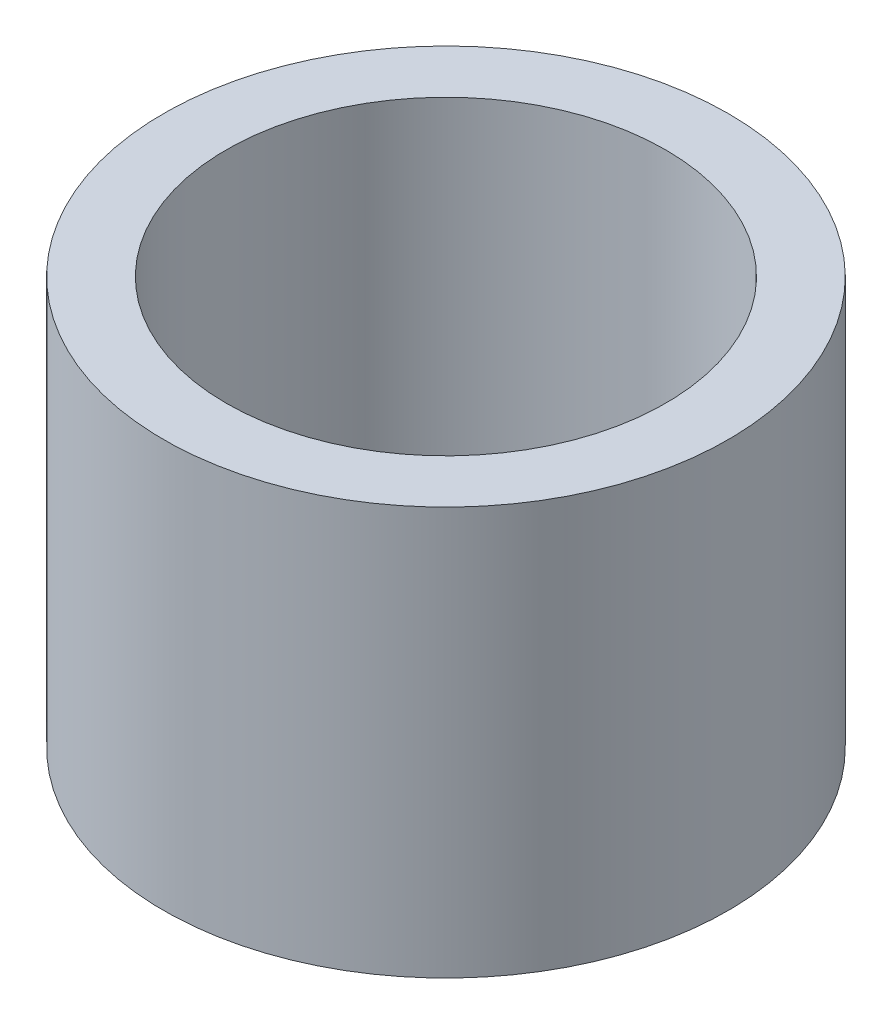
ISO-10303-21;
HEADER;
FILE_DESCRIPTION(('STEP AP214'),'2;1');
FILE_NAME('part.step','',(''),(''),'','','');
FILE_SCHEMA(('AUTOMOTIVE_DESIGN { 1 0 10303 214 1 1 1 1 }'));
ENDSEC;
DATA;
#1=APPLICATION_CONTEXT('core data for automotive mechanical design processes');
#2=APPLICATION_PROTOCOL_DEFINITION('international standard','automotive_design',2000,#1);
#3=PRODUCT_CONTEXT('',#1,'mechanical');
#4=PRODUCT('Part','Part','',(#3));
#5=PRODUCT_RELATED_PRODUCT_CATEGORY('part','',(#4));
#6=PRODUCT_DEFINITION_FORMATION('','',#4);
#7=PRODUCT_DEFINITION_CONTEXT('part definition',#1,'design');
#8=PRODUCT_DEFINITION('design','',#6,#7);
#9=PRODUCT_DEFINITION_SHAPE('','',#8);
#10=(LENGTH_UNIT() NAMED_UNIT(*) SI_UNIT(.MILLI.,.METRE.));
#11=(NAMED_UNIT(*) PLANE_ANGLE_UNIT() SI_UNIT($,.RADIAN.));
#12=(NAMED_UNIT(*) SI_UNIT($,.STERADIAN.) SOLID_ANGLE_UNIT());
#13=UNCERTAINTY_MEASURE_WITH_UNIT(LENGTH_MEASURE(1.E-05),#10,'distance_accuracy_value','');
#14=(GEOMETRIC_REPRESENTATION_CONTEXT(3) GLOBAL_UNCERTAINTY_ASSIGNED_CONTEXT((#13)) GLOBAL_UNIT_ASSIGNED_CONTEXT((#10,
#11,#12)) REPRESENTATION_CONTEXT('',''));
#15=CARTESIAN_POINT('',(0.,0.,0.));
#16=DIRECTION('',(0.,0.,1.));
#17=DIRECTION('',(1.,0.,0.));
#18=AXIS2_PLACEMENT_3D('',#15,#16,#17);
#19=CARTESIAN_POINT('',(0.,13.,0.));
#20=DIRECTION('',(0.,1.,0.));
#21=DIRECTION('',(0.,0.,1.));
#22=AXIS2_PLACEMENT_3D('',#19,#20,#21);
#23=PLANE('',#22);
#24=CARTESIAN_POINT('',(0.,13.,0.));
#25=DIRECTION('',(0.,1.,0.));
#26=DIRECTION('',(0.,0.,1.));
#27=AXIS2_PLACEMENT_3D('',#24,#25,#26);
#28=CIRCLE('',#27,9.);
#29=CARTESIAN_POINT('',(0.,13.,-9.));
#30=VERTEX_POINT('',#29);
#31=EDGE_CURVE('E10',#30,#30,#28,.T.);
#32=ORIENTED_EDGE('',*,*,#31,.T.);
#33=EDGE_LOOP('',(#32));
#34=FACE_BOUND('',#33,.T.);
#35=CARTESIAN_POINT('',(0.,13.,0.));
#36=DIRECTION('',(0.,1.,0.));
#37=DIRECTION('',(0.,0.,1.));
#38=AXIS2_PLACEMENT_3D('',#35,#36,#37);
#39=CIRCLE('',#38,7.);
#40=CARTESIAN_POINT('',(0.,13.,-7.));
#41=VERTEX_POINT('',#40);
#42=EDGE_CURVE('E50',#41,#41,#39,.T.);
#43=ORIENTED_EDGE('',*,*,#42,.F.);
#44=EDGE_LOOP('',(#43));
#45=FACE_BOUND('',#44,.T.);
#46=ADVANCED_FACE('F37',(#34,#45),#23,.T.);
#47=CARTESIAN_POINT('',(0.,0.,0.));
#48=DIRECTION('',(0.,1.,0.));
#49=DIRECTION('',(0.,0.,1.));
#50=AXIS2_PLACEMENT_3D('',#47,#48,#49);
#51=PLANE('',#50);
#52=CARTESIAN_POINT('',(0.,0.,0.));
#53=DIRECTION('',(0.,1.,0.));
#54=DIRECTION('',(0.,0.,1.));
#55=AXIS2_PLACEMENT_3D('',#52,#53,#54);
#56=CIRCLE('',#55,9.);
#57=CARTESIAN_POINT('',(0.,0.,-9.));
#58=VERTEX_POINT('',#57);
#59=EDGE_CURVE('E41',#58,#58,#56,.T.);
#60=ORIENTED_EDGE('',*,*,#59,.F.);
#61=EDGE_LOOP('',(#60));
#62=FACE_BOUND('',#61,.T.);
#63=CARTESIAN_POINT('',(0.,0.,0.));
#64=DIRECTION('',(0.,1.,0.));
#65=DIRECTION('',(0.,0.,1.));
#66=AXIS2_PLACEMENT_3D('',#63,#64,#65);
#67=CIRCLE('',#66,7.);
#68=CARTESIAN_POINT('',(0.,0.,-7.));
#69=VERTEX_POINT('',#68);
#70=EDGE_CURVE('E52',#69,#69,#67,.T.);
#71=ORIENTED_EDGE('',*,*,#70,.T.);
#72=EDGE_LOOP('',(#71));
#73=FACE_BOUND('',#72,.T.);
#74=ADVANCED_FACE('F64',(#62,#73),#51,.F.);
#75=CARTESIAN_POINT('',(0.,13.,0.));
#76=DIRECTION('',(0.,-1.,0.));
#77=DIRECTION('',(0.,0.,-1.));
#78=AXIS2_PLACEMENT_3D('',#75,#76,#77);
#79=CYLINDRICAL_SURFACE('',#78,9.);
#80=CARTESIAN_POINT('',(0.,13.,-9.));
#81=CARTESIAN_POINT('',(0.,12.8645833333333,-9.));
#82=CARTESIAN_POINT('',(0.,12.7291666666667,-9.));
#83=CARTESIAN_POINT('',(0.,12.4583333333333,-9.));
#84=CARTESIAN_POINT('',(0.,12.3229166666667,-9.));
#85=CARTESIAN_POINT('',(0.,12.0520833333333,-9.));
#86=CARTESIAN_POINT('',(0.,11.9166666666667,-9.));
#87=CARTESIAN_POINT('',(0.,11.6458333333333,-9.));
#88=CARTESIAN_POINT('',(0.,11.5104166666667,-9.));
#89=CARTESIAN_POINT('',(0.,11.2395833333333,-9.));
#90=CARTESIAN_POINT('',(0.,11.1041666666667,-9.));
#91=CARTESIAN_POINT('',(0.,10.8333333333333,-9.));
#92=CARTESIAN_POINT('',(0.,10.6979166666667,-9.));
#93=CARTESIAN_POINT('',(0.,10.4270833333333,-9.));
#94=CARTESIAN_POINT('',(0.,10.2916666666667,-9.));
#95=CARTESIAN_POINT('',(0.,10.0208333333333,-9.));
#96=CARTESIAN_POINT('',(0.,9.88541666666667,-9.));
#97=CARTESIAN_POINT('',(0.,9.61458333333333,-9.));
#98=CARTESIAN_POINT('',(0.,9.47916666666667,-9.));
#99=CARTESIAN_POINT('',(0.,9.20833333333333,-9.));
#100=CARTESIAN_POINT('',(0.,9.07291666666666,-9.));
#101=CARTESIAN_POINT('',(0.,8.80208333333333,-9.));
#102=CARTESIAN_POINT('',(0.,8.66666666666667,-9.));
#103=CARTESIAN_POINT('',(0.,8.39583333333333,-9.));
#104=CARTESIAN_POINT('',(0.,8.26041666666667,-9.));
#105=CARTESIAN_POINT('',(0.,7.98958333333333,-9.));
#106=CARTESIAN_POINT('',(0.,7.85416666666667,-9.));
#107=CARTESIAN_POINT('',(0.,7.58333333333333,-9.));
#108=CARTESIAN_POINT('',(0.,7.44791666666667,-9.));
#109=CARTESIAN_POINT('',(0.,7.17708333333333,-9.));
#110=CARTESIAN_POINT('',(0.,7.04166666666667,-9.));
#111=CARTESIAN_POINT('',(0.,6.77083333333333,-9.));
#112=CARTESIAN_POINT('',(0.,6.63541666666667,-9.));
#113=CARTESIAN_POINT('',(0.,6.36458333333333,-9.));
#114=CARTESIAN_POINT('',(0.,6.22916666666667,-9.));
#115=CARTESIAN_POINT('',(0.,5.95833333333333,-9.));
#116=CARTESIAN_POINT('',(0.,5.82291666666667,-9.));
#117=CARTESIAN_POINT('',(0.,5.55208333333333,-9.));
#118=CARTESIAN_POINT('',(0.,5.41666666666667,-9.));
#119=CARTESIAN_POINT('',(0.,5.14583333333333,-9.));
#120=CARTESIAN_POINT('',(0.,5.01041666666667,-9.));
#121=CARTESIAN_POINT('',(0.,4.73958333333333,-9.));
#122=CARTESIAN_POINT('',(0.,4.60416666666667,-9.));
#123=CARTESIAN_POINT('',(0.,4.33333333333333,-9.));
#124=CARTESIAN_POINT('',(0.,4.19791666666667,-9.));
#125=CARTESIAN_POINT('',(0.,3.92708333333333,-9.));
#126=CARTESIAN_POINT('',(0.,3.79166666666667,-9.));
#127=CARTESIAN_POINT('',(0.,3.52083333333333,-9.));
#128=CARTESIAN_POINT('',(0.,3.38541666666667,-9.));
#129=CARTESIAN_POINT('',(0.,3.11458333333333,-9.));
#130=CARTESIAN_POINT('',(0.,2.97916666666667,-9.));
#131=CARTESIAN_POINT('',(0.,2.70833333333333,-9.));
#132=CARTESIAN_POINT('',(0.,2.57291666666667,-9.));
#133=CARTESIAN_POINT('',(0.,2.30208333333333,-9.));
#134=CARTESIAN_POINT('',(0.,2.16666666666667,-9.));
#135=CARTESIAN_POINT('',(0.,1.89583333333333,-9.));
#136=CARTESIAN_POINT('',(0.,1.76041666666667,-9.));
#137=CARTESIAN_POINT('',(0.,1.48958333333333,-9.));
#138=CARTESIAN_POINT('',(0.,1.35416666666667,-9.));
#139=CARTESIAN_POINT('',(0.,1.08333333333333,-9.));
#140=CARTESIAN_POINT('',(0.,0.947916666666667,-9.));
#141=CARTESIAN_POINT('',(0.,0.677083333333334,-9.));
#142=CARTESIAN_POINT('',(0.,0.541666666666667,-9.));
#143=CARTESIAN_POINT('',(0.,0.270833333333334,-9.));
#144=CARTESIAN_POINT('',(0.,0.135416666666667,-9.));
#145=CARTESIAN_POINT('',(0.,0.,-9.));
#146=B_SPLINE_CURVE_WITH_KNOTS('',3,(#80,#81,#82,#83,#84,#85,#86,#87,#88,#89,#90,#91,#92,#93,
#94,#95,#96,#97,#98,#99,#100,#101,#102,#103,#104,#105,#106,#107,#108,#109,#110,#111,#112,#113,
#114,#115,#116,#117,#118,#119,#120,#121,#122,#123,#124,#125,#126,#127,#128,#129,#130,#131,#132,
#133,#134,#135,#136,#137,#138,#139,#140,#141,#142,#143,#144,#145),.UNSPECIFIED.,.F.,.F.,(4,2,2,
2,2,2,2,2,2,2,2,2,2,2,2,2,2,2,2,2,2,2,2,2,2,2,2,2,2,2,2,2,4),(0.,0.40625,0.812500000000001,
1.21875,1.625,2.03125,2.4375,2.84375,3.25,3.65625,4.0625,4.46875,4.875,5.28125,5.6875,6.09375,
6.5,6.90625,7.3125,7.71875,8.125,8.53125,8.9375,9.34375,9.75,10.15625,10.5625,10.96875,11.375,
11.78125,12.1875,12.59375,13.),.UNSPECIFIED.);
#147=EDGE_CURVE('BSEAM39',#30,#58,#146,.T.);
#148=ORIENTED_EDGE('',*,*,#31,.F.);
#149=ORIENTED_EDGE('',*,*,#59,.T.);
#150=ORIENTED_EDGE('',*,*,#147,.T.);
#151=ORIENTED_EDGE('',*,*,#147,.F.);
#152=EDGE_LOOP('',(#148,#150,#149,#151));
#153=FACE_BOUND('',#152,.T.);
#154=ADVANCED_FACE('F39',(#153),#79,.T.);
#155=CARTESIAN_POINT('',(0.,13.,0.));
#156=DIRECTION('',(0.,-1.,0.));
#157=DIRECTION('',(0.,0.,-1.));
#158=AXIS2_PLACEMENT_3D('',#155,#156,#157);
#159=CYLINDRICAL_SURFACE('',#158,7.);
#160=CARTESIAN_POINT('',(0.,13.,-7.));
#161=CARTESIAN_POINT('',(0.,12.8645833333333,-7.));
#162=CARTESIAN_POINT('',(0.,12.7291666666667,-7.));
#163=CARTESIAN_POINT('',(0.,12.4583333333333,-7.));
#164=CARTESIAN_POINT('',(0.,12.3229166666667,-7.));
#165=CARTESIAN_POINT('',(0.,12.0520833333333,-7.));
#166=CARTESIAN_POINT('',(0.,11.9166666666667,-7.));
#167=CARTESIAN_POINT('',(0.,11.6458333333333,-7.));
#168=CARTESIAN_POINT('',(0.,11.5104166666667,-7.));
#169=CARTESIAN_POINT('',(0.,11.2395833333333,-7.));
#170=CARTESIAN_POINT('',(0.,11.1041666666667,-7.));
#171=CARTESIAN_POINT('',(0.,10.8333333333333,-7.));
#172=CARTESIAN_POINT('',(0.,10.6979166666667,-7.));
#173=CARTESIAN_POINT('',(0.,10.4270833333333,-7.));
#174=CARTESIAN_POINT('',(0.,10.2916666666667,-7.));
#175=CARTESIAN_POINT('',(0.,10.0208333333333,-7.));
#176=CARTESIAN_POINT('',(0.,9.88541666666667,-7.));
#177=CARTESIAN_POINT('',(0.,9.61458333333333,-7.));
#178=CARTESIAN_POINT('',(0.,9.47916666666667,-7.));
#179=CARTESIAN_POINT('',(0.,9.20833333333333,-7.));
#180=CARTESIAN_POINT('',(0.,9.07291666666667,-7.));
#181=CARTESIAN_POINT('',(0.,8.80208333333333,-7.));
#182=CARTESIAN_POINT('',(0.,8.66666666666667,-7.));
#183=CARTESIAN_POINT('',(0.,8.39583333333333,-7.));
#184=CARTESIAN_POINT('',(0.,8.26041666666667,-7.));
#185=CARTESIAN_POINT('',(0.,7.98958333333333,-7.));
#186=CARTESIAN_POINT('',(0.,7.85416666666667,-7.));
#187=CARTESIAN_POINT('',(0.,7.58333333333333,-7.));
#188=CARTESIAN_POINT('',(0.,7.44791666666667,-7.));
#189=CARTESIAN_POINT('',(0.,7.17708333333333,-7.));
#190=CARTESIAN_POINT('',(0.,7.04166666666667,-7.));
#191=CARTESIAN_POINT('',(0.,6.77083333333333,-7.));
#192=CARTESIAN_POINT('',(0.,6.63541666666667,-7.));
#193=CARTESIAN_POINT('',(0.,6.36458333333333,-7.));
#194=CARTESIAN_POINT('',(0.,6.22916666666667,-7.));
#195=CARTESIAN_POINT('',(0.,5.95833333333333,-7.));
#196=CARTESIAN_POINT('',(0.,5.82291666666667,-7.));
#197=CARTESIAN_POINT('',(0.,5.55208333333333,-7.));
#198=CARTESIAN_POINT('',(0.,5.41666666666667,-7.));
#199=CARTESIAN_POINT('',(0.,5.14583333333333,-7.));
#200=CARTESIAN_POINT('',(0.,5.01041666666667,-7.));
#201=CARTESIAN_POINT('',(0.,4.73958333333333,-7.));
#202=CARTESIAN_POINT('',(0.,4.60416666666667,-7.));
#203=CARTESIAN_POINT('',(0.,4.33333333333333,-7.));
#204=CARTESIAN_POINT('',(0.,4.19791666666667,-7.));
#205=CARTESIAN_POINT('',(0.,3.92708333333333,-7.));
#206=CARTESIAN_POINT('',(0.,3.79166666666667,-7.));
#207=CARTESIAN_POINT('',(0.,3.52083333333333,-7.));
#208=CARTESIAN_POINT('',(0.,3.38541666666667,-7.));
#209=CARTESIAN_POINT('',(0.,3.11458333333333,-7.));
#210=CARTESIAN_POINT('',(0.,2.97916666666667,-7.));
#211=CARTESIAN_POINT('',(0.,2.70833333333333,-7.));
#212=CARTESIAN_POINT('',(0.,2.57291666666667,-7.));
#213=CARTESIAN_POINT('',(0.,2.30208333333333,-7.));
#214=CARTESIAN_POINT('',(0.,2.16666666666667,-7.));
#215=CARTESIAN_POINT('',(0.,1.89583333333333,-7.));
#216=CARTESIAN_POINT('',(0.,1.76041666666667,-7.));
#217=CARTESIAN_POINT('',(0.,1.48958333333333,-7.));
#218=CARTESIAN_POINT('',(0.,1.35416666666667,-7.));
#219=CARTESIAN_POINT('',(0.,1.08333333333333,-7.));
#220=CARTESIAN_POINT('',(0.,0.947916666666667,-7.));
#221=CARTESIAN_POINT('',(0.,0.677083333333334,-7.));
#222=CARTESIAN_POINT('',(0.,0.541666666666667,-7.));
#223=CARTESIAN_POINT('',(0.,0.270833333333334,-7.));
#224=CARTESIAN_POINT('',(0.,0.135416666666667,-7.));
#225=CARTESIAN_POINT('',(0.,0.,-7.));
#226=B_SPLINE_CURVE_WITH_KNOTS('',3,(#160,#161,#162,#163,#164,#165,#166,#167,#168,#169,#170,
#171,#172,#173,#174,#175,#176,#177,#178,#179,#180,#181,#182,#183,#184,#185,#186,#187,#188,#189,
#190,#191,#192,#193,#194,#195,#196,#197,#198,#199,#200,#201,#202,#203,#204,#205,#206,#207,#208,
#209,#210,#211,#212,#213,#214,#215,#216,#217,#218,#219,#220,#221,#222,#223,#224,#225),
.UNSPECIFIED.,.F.,.F.,(4,2,2,2,2,2,2,2,2,2,2,2,2,2,2,2,2,2,2,2,2,2,2,2,2,2,2,2,2,2,2,2,4),(0.,
0.406249999999999,0.812499999999999,1.21875,1.625,2.03125,2.4375,2.84375,3.25,3.65625,4.0625,
4.46875,4.875,5.28125,5.6875,6.09375,6.5,6.90625,7.3125,7.71875,8.125,8.53125,8.9375,9.34375,
9.75,10.15625,10.5625,10.96875,11.375,11.78125,12.1875,12.59375,13.),.UNSPECIFIED.);
#227=EDGE_CURVE('BSEAM60',#41,#69,#226,.T.);
#228=ORIENTED_EDGE('',*,*,#42,.T.);
#229=ORIENTED_EDGE('',*,*,#70,.F.);
#230=ORIENTED_EDGE('',*,*,#227,.T.);
#231=ORIENTED_EDGE('',*,*,#227,.F.);
#232=EDGE_LOOP('',(#228,#230,#229,#231));
#233=FACE_BOUND('',#232,.T.);
#234=ADVANCED_FACE('F60',(#233),#159,.F.);
#235=CLOSED_SHELL('',(#46,#74,#154,#234));
#236=MANIFOLD_SOLID_BREP('B2',#235);
#237=ADVANCED_BREP_SHAPE_REPRESENTATION('',(#18,#236),#14);
#238=SHAPE_DEFINITION_REPRESENTATION(#9,#237);
ENDSEC;
END-ISO-10303-21;
